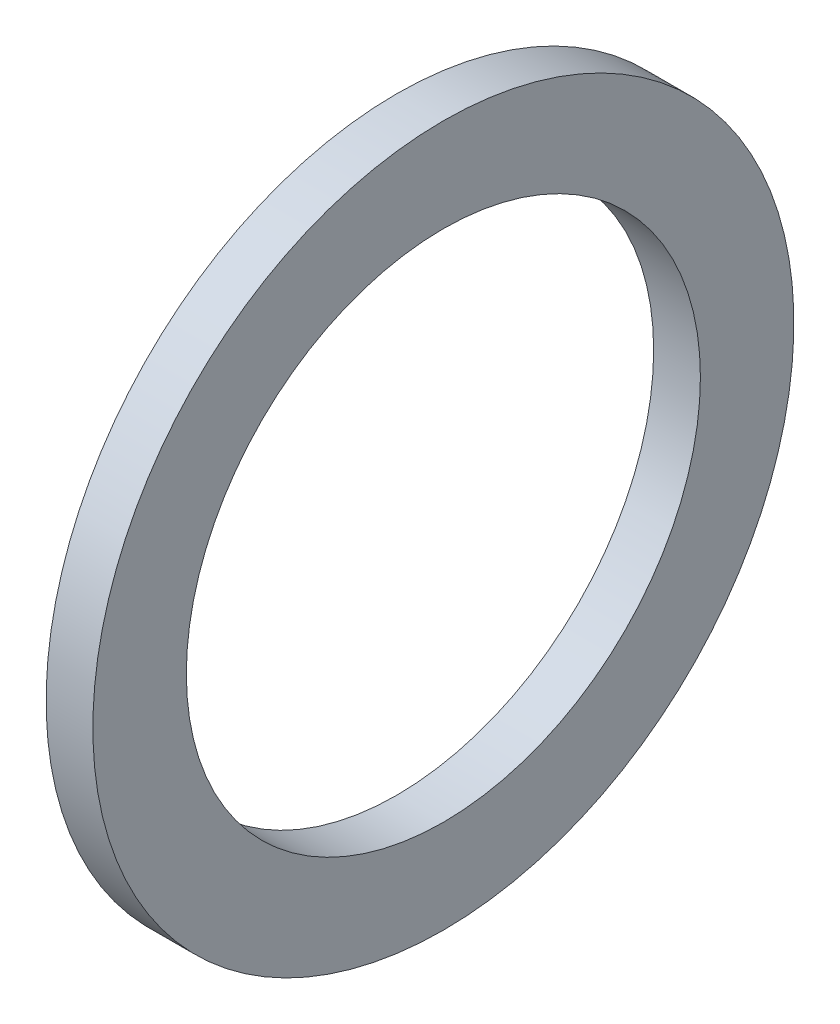
ISO-10303-21;
HEADER;
FILE_DESCRIPTION(('STEP AP214'),'2;1');
FILE_NAME('part.step','',(''),(''),'','','');
FILE_SCHEMA(('AUTOMOTIVE_DESIGN { 1 0 10303 214 1 1 1 1 }'));
ENDSEC;
DATA;
#1=APPLICATION_CONTEXT('core data for automotive mechanical design processes');
#2=APPLICATION_PROTOCOL_DEFINITION('international standard','automotive_design',2000,#1);
#3=PRODUCT_CONTEXT('',#1,'mechanical');
#4=PRODUCT('Part','Part','',(#3));
#5=PRODUCT_RELATED_PRODUCT_CATEGORY('part','',(#4));
#6=PRODUCT_DEFINITION_FORMATION('','',#4);
#7=PRODUCT_DEFINITION_CONTEXT('part definition',#1,'design');
#8=PRODUCT_DEFINITION('design','',#6,#7);
#9=PRODUCT_DEFINITION_SHAPE('','',#8);
#10=(LENGTH_UNIT() NAMED_UNIT(*) SI_UNIT(.MILLI.,.METRE.));
#11=(NAMED_UNIT(*) PLANE_ANGLE_UNIT() SI_UNIT($,.RADIAN.));
#12=(NAMED_UNIT(*) SI_UNIT($,.STERADIAN.) SOLID_ANGLE_UNIT());
#13=UNCERTAINTY_MEASURE_WITH_UNIT(LENGTH_MEASURE(1.E-05),#10,'distance_accuracy_value','');
#14=(GEOMETRIC_REPRESENTATION_CONTEXT(3) GLOBAL_UNCERTAINTY_ASSIGNED_CONTEXT((#13)) GLOBAL_UNIT_ASSIGNED_CONTEXT((#10,
#11,#12)) REPRESENTATION_CONTEXT('',''));
#15=CARTESIAN_POINT('',(0.,0.,0.));
#16=DIRECTION('',(0.,0.,1.));
#17=DIRECTION('',(1.,0.,0.));
#18=AXIS2_PLACEMENT_3D('',#15,#16,#17);
#19=CARTESIAN_POINT('',(0.,0.,0.));
#20=DIRECTION('',(-1.,0.,0.));
#21=DIRECTION('',(0.,0.,1.));
#22=AXIS2_PLACEMENT_3D('',#19,#20,#21);
#23=PLANE('',#22);
#24=CARTESIAN_POINT('',(0.,0.,0.));
#25=DIRECTION('',(1.,0.,0.));
#26=DIRECTION('',(0.,-1.,0.));
#27=AXIS2_PLACEMENT_3D('',#24,#25,#26);
#28=CIRCLE('',#27,11.);
#29=CARTESIAN_POINT('',(0.,11.,0.));
#30=VERTEX_POINT('',#29);
#31=EDGE_CURVE('E58',#30,#30,#28,.T.);
#32=ORIENTED_EDGE('',*,*,#31,.T.);
#33=EDGE_LOOP('',(#32));
#34=FACE_BOUND('',#33,.T.);
#35=CARTESIAN_POINT('',(0.,0.,0.));
#36=DIRECTION('',(-1.,0.,0.));
#37=DIRECTION('',(0.,-1.,0.));
#38=AXIS2_PLACEMENT_3D('',#35,#36,#37);
#39=CIRCLE('',#38,15.);
#40=CARTESIAN_POINT('',(0.,15.,0.));
#41=VERTEX_POINT('',#40);
#42=EDGE_CURVE('E11',#41,#41,#39,.T.);
#43=ORIENTED_EDGE('',*,*,#42,.T.);
#44=EDGE_LOOP('',(#43));
#45=FACE_BOUND('',#44,.T.);
#46=ADVANCED_FACE('F17',(#34,#45),#23,.T.);
#47=CARTESIAN_POINT('',(2.,0.,0.));
#48=DIRECTION('',(-1.,0.,0.));
#49=DIRECTION('',(0.,0.,1.));
#50=AXIS2_PLACEMENT_3D('',#47,#48,#49);
#51=PLANE('',#50);
#52=CARTESIAN_POINT('',(2.,0.,0.));
#53=DIRECTION('',(-1.,0.,0.));
#54=DIRECTION('',(0.,-1.,0.));
#55=AXIS2_PLACEMENT_3D('',#52,#53,#54);
#56=CIRCLE('',#55,11.);
#57=CARTESIAN_POINT('',(2.,11.,0.));
#58=VERTEX_POINT('',#57);
#59=EDGE_CURVE('E59',#58,#58,#56,.T.);
#60=ORIENTED_EDGE('',*,*,#59,.T.);
#61=EDGE_LOOP('',(#60));
#62=FACE_BOUND('',#61,.T.);
#63=CARTESIAN_POINT('',(2.,0.,0.));
#64=DIRECTION('',(-1.,0.,0.));
#65=DIRECTION('',(0.,-1.,0.));
#66=AXIS2_PLACEMENT_3D('',#63,#64,#65);
#67=CIRCLE('',#66,15.);
#68=CARTESIAN_POINT('',(2.,15.,0.));
#69=VERTEX_POINT('',#68);
#70=EDGE_CURVE('E20',#69,#69,#67,.T.);
#71=ORIENTED_EDGE('',*,*,#70,.F.);
#72=EDGE_LOOP('',(#71));
#73=FACE_BOUND('',#72,.T.);
#74=ADVANCED_FACE('F80',(#62,#73),#51,.F.);
#75=CARTESIAN_POINT('',(0.,0.,0.));
#76=DIRECTION('',(1.,0.,0.));
#77=DIRECTION('',(0.,-1.,0.));
#78=AXIS2_PLACEMENT_3D('',#75,#76,#77);
#79=CYLINDRICAL_SURFACE('',#78,15.);
#80=ORIENTED_EDGE('',*,*,#70,.T.);
#81=DIRECTION('',(-1.,0.,0.));
#82=VECTOR('',#81,1.);
#83=CARTESIAN_POINT('',(0.,15.,0.));
#84=LINE('',#83,#82);
#85=EDGE_CURVE('E26',#69,#41,#84,.T.);
#86=ORIENTED_EDGE('',*,*,#85,.T.);
#87=ORIENTED_EDGE('',*,*,#42,.F.);
#88=ORIENTED_EDGE('',*,*,#85,.F.);
#89=EDGE_LOOP('',(#80,#86,#87,#88));
#90=FACE_BOUND('',#89,.T.);
#91=ADVANCED_FACE('F83',(#90),#79,.T.);
#92=CARTESIAN_POINT('',(0.,0.,0.));
#93=DIRECTION('',(1.,0.,0.));
#94=DIRECTION('',(0.,-1.,0.));
#95=AXIS2_PLACEMENT_3D('',#92,#93,#94);
#96=CYLINDRICAL_SURFACE('',#95,11.);
#97=ORIENTED_EDGE('',*,*,#31,.F.);
#98=DIRECTION('',(1.,0.,0.));
#99=VECTOR('',#98,1.);
#100=CARTESIAN_POINT('',(0.,11.,0.));
#101=LINE('',#100,#99);
#102=EDGE_CURVE('E55',#30,#58,#101,.T.);
#103=ORIENTED_EDGE('',*,*,#102,.T.);
#104=ORIENTED_EDGE('',*,*,#59,.F.);
#105=ORIENTED_EDGE('',*,*,#102,.F.);
#106=EDGE_LOOP('',(#97,#103,#104,#105));
#107=FACE_BOUND('',#106,.T.);
#108=ADVANCED_FACE('F57',(#107),#96,.F.);
#109=CLOSED_SHELL('',(#46,#74,#91,#108));
#110=MANIFOLD_SOLID_BREP('B1',#109);
#111=ADVANCED_BREP_SHAPE_REPRESENTATION('',(#18,#110),#14);
#112=SHAPE_DEFINITION_REPRESENTATION(#9,#111);
ENDSEC;
END-ISO-10303-21;
